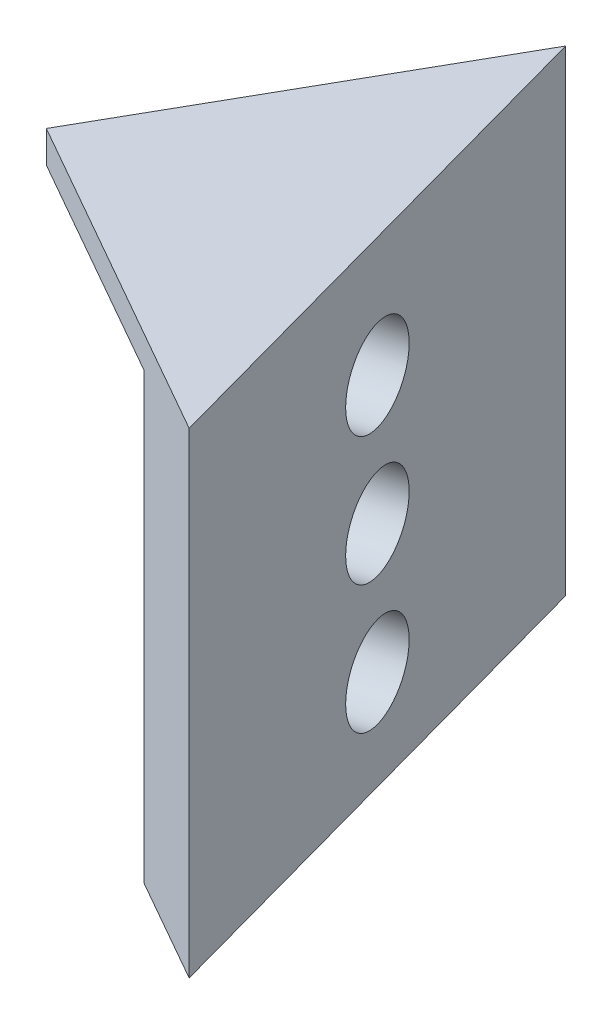
ISO-10303-21;
HEADER;
FILE_DESCRIPTION(('STEP AP214'),'2;1');
FILE_NAME('part.step','',(''),(''),'','','');
FILE_SCHEMA(('AUTOMOTIVE_DESIGN { 1 0 10303 214 1 1 1 1 }'));
ENDSEC;
DATA;
#1=APPLICATION_CONTEXT('core data for automotive mechanical design processes');
#2=APPLICATION_PROTOCOL_DEFINITION('international standard','automotive_design',2000,#1);
#3=PRODUCT_CONTEXT('',#1,'mechanical');
#4=PRODUCT('Part','Part','',(#3));
#5=PRODUCT_RELATED_PRODUCT_CATEGORY('part','',(#4));
#6=PRODUCT_DEFINITION_FORMATION('','',#4);
#7=PRODUCT_DEFINITION_CONTEXT('part definition',#1,'design');
#8=PRODUCT_DEFINITION('design','',#6,#7);
#9=PRODUCT_DEFINITION_SHAPE('','',#8);
#10=(LENGTH_UNIT() NAMED_UNIT(*) SI_UNIT(.MILLI.,.METRE.));
#11=(NAMED_UNIT(*) PLANE_ANGLE_UNIT() SI_UNIT($,.RADIAN.));
#12=(NAMED_UNIT(*) SI_UNIT($,.STERADIAN.) SOLID_ANGLE_UNIT());
#13=UNCERTAINTY_MEASURE_WITH_UNIT(LENGTH_MEASURE(1.E-05),#10,'distance_accuracy_value','');
#14=(GEOMETRIC_REPRESENTATION_CONTEXT(3) GLOBAL_UNCERTAINTY_ASSIGNED_CONTEXT((#13)) GLOBAL_UNIT_ASSIGNED_CONTEXT((#10,
#11,#12)) REPRESENTATION_CONTEXT('',''));
#15=CARTESIAN_POINT('',(0.,0.,0.));
#16=DIRECTION('',(0.,0.,1.));
#17=DIRECTION('',(1.,0.,0.));
#18=AXIS2_PLACEMENT_3D('',#15,#16,#17);
#19=CARTESIAN_POINT('',(0.,25.4,0.));
#20=DIRECTION('',(0.869294507164745,0.,0.494294507164709));
#21=DIRECTION('',(0.494294507164709,0.,-0.869294507164745));
#22=AXIS2_PLACEMENT_3D('',#19,#20,#21);
#23=PLANE('',#22);
#24=DIRECTION('',(0.,-1.,0.));
#25=VECTOR('',#24,1.);
#26=CARTESIAN_POINT('',(0.,25.4,0.));
#27=LINE('',#26,#25);
#28=CARTESIAN_POINT('',(0.,25.4,0.));
#29=VERTEX_POINT('',#28);
#30=CARTESIAN_POINT('',(0.,0.,0.));
#31=VERTEX_POINT('',#30);
#32=EDGE_CURVE('E53',#29,#31,#27,.T.);
#33=ORIENTED_EDGE('',*,*,#32,.F.);
#34=DIRECTION('',(-0.494294507164709,0.,0.869294507164745));
#35=VECTOR('',#34,1.);
#36=CARTESIAN_POINT('',(0.,25.4,0.));
#37=LINE('',#36,#35);
#38=CARTESIAN_POINT('',(150.660965783814,25.4,-264.960965783834));
#39=VERTEX_POINT('',#38);
#40=EDGE_CURVE('E100',#39,#29,#37,.T.);
#41=ORIENTED_EDGE('',*,*,#40,.F.);
#42=DIRECTION('',(0.,-1.,0.));
#43=VECTOR('',#42,1.);
#44=CARTESIAN_POINT('',(150.660965783814,25.4,-264.960965783834));
#45=LINE('',#44,#43);
#46=CARTESIAN_POINT('',(150.660965783814,-355.6,-264.960965783834));
#47=VERTEX_POINT('',#46);
#48=EDGE_CURVE('E97',#39,#47,#45,.T.);
#49=ORIENTED_EDGE('',*,*,#48,.T.);
#50=DIRECTION('',(-0.494294507164709,0.,0.869294507164745));
#51=VECTOR('',#50,1.);
#52=CARTESIAN_POINT('',(150.660965783814,-355.6,-264.960965783834));
#53=LINE('',#52,#51);
#54=CARTESIAN_POINT('',(102.937728623796,-355.6,-181.032159523601));
#55=VERTEX_POINT('',#54);
#56=EDGE_CURVE('E99',#47,#55,#53,.T.);
#57=ORIENTED_EDGE('',*,*,#56,.T.);
#58=DIRECTION('',(0.,1.,0.));
#59=VECTOR('',#58,1.);
#60=CARTESIAN_POINT('',(102.937728623796,-355.6,-181.032159523601));
#61=LINE('',#60,#59);
#62=CARTESIAN_POINT('',(102.937728623796,0.,-181.032159523601));
#63=VERTEX_POINT('',#62);
#64=EDGE_CURVE('E60',#55,#63,#61,.T.);
#65=ORIENTED_EDGE('',*,*,#64,.T.);
#66=DIRECTION('',(-0.494294507164709,0.,0.869294507164745));
#67=VECTOR('',#66,1.);
#68=CARTESIAN_POINT('',(0.,0.,0.));
#69=LINE('',#68,#67);
#70=EDGE_CURVE('E77',#63,#31,#69,.T.);
#71=ORIENTED_EDGE('',*,*,#70,.T.);
#72=EDGE_LOOP('',(#33,#41,#49,#57,#65,#71));
#73=FACE_BOUND('',#72,.T.);
#74=ADVANCED_FACE('F45',(#73),#23,.F.);
#75=CARTESIAN_POINT('',(0.,25.4,0.));
#76=DIRECTION('',(0.494294507164709,0.,-0.869294507164745));
#77=DIRECTION('',(-0.869294507164745,0.,-0.494294507164709));
#78=AXIS2_PLACEMENT_3D('',#75,#76,#77);
#79=PLANE('',#78);
#80=DIRECTION('',(0.869294507164745,0.,0.494294507164709));
#81=VECTOR('',#80,1.);
#82=CARTESIAN_POINT('',(0.,0.,0.));
#83=LINE('',#82,#81);
#84=CARTESIAN_POINT('',(181.032159523588,0.,102.937728623789));
#85=VERTEX_POINT('',#84);
#86=EDGE_CURVE('E139',#31,#85,#83,.T.);
#87=ORIENTED_EDGE('',*,*,#86,.T.);
#88=DIRECTION('',(0.,1.,0.));
#89=VECTOR('',#88,1.);
#90=CARTESIAN_POINT('',(181.032159523588,-355.6,102.937728623789));
#91=LINE('',#90,#89);
#92=CARTESIAN_POINT('',(181.032159523588,-355.6,102.937728623789));
#93=VERTEX_POINT('',#92);
#94=EDGE_CURVE('E85',#93,#85,#91,.T.);
#95=ORIENTED_EDGE('',*,*,#94,.F.);
#96=DIRECTION('',(0.869294507164745,0.,0.494294507164709));
#97=VECTOR('',#96,1.);
#98=CARTESIAN_POINT('',(264.960965783814,-355.6,150.660965783803));
#99=LINE('',#98,#97);
#100=CARTESIAN_POINT('',(264.960965783814,-355.6,150.660965783803));
#101=VERTEX_POINT('',#100);
#102=EDGE_CURVE('E129',#93,#101,#99,.T.);
#103=ORIENTED_EDGE('',*,*,#102,.T.);
#104=DIRECTION('',(0.,-1.,0.));
#105=VECTOR('',#104,1.);
#106=CARTESIAN_POINT('',(264.960965783814,25.4,150.660965783803));
#107=LINE('',#106,#105);
#108=CARTESIAN_POINT('',(264.960965783814,25.4,150.660965783803));
#109=VERTEX_POINT('',#108);
#110=EDGE_CURVE('E104',#109,#101,#107,.T.);
#111=ORIENTED_EDGE('',*,*,#110,.F.);
#112=DIRECTION('',(0.869294507164745,0.,0.494294507164709));
#113=VECTOR('',#112,1.);
#114=CARTESIAN_POINT('',(0.,25.4,0.));
#115=LINE('',#114,#113);
#116=EDGE_CURVE('E138',#29,#109,#115,.T.);
#117=ORIENTED_EDGE('',*,*,#116,.F.);
#118=ORIENTED_EDGE('',*,*,#32,.T.);
#119=EDGE_LOOP('',(#87,#95,#103,#111,#117,#118));
#120=FACE_BOUND('',#119,.T.);
#121=ADVANCED_FACE('F154',(#120),#79,.F.);
#122=CARTESIAN_POINT('',(264.960965783814,25.4,150.660965783803));
#123=DIRECTION('',(-0.964203038783847,0.,0.265165042944946));
#124=DIRECTION('',(0.265165042944946,0.,0.964203038783847));
#125=AXIS2_PLACEMENT_3D('',#122,#123,#124);
#126=PLANE('',#125);
#127=CARTESIAN_POINT('',(207.810965783816,-70.2908417812,-57.1500000000104));
#128=DIRECTION('',(-0.964203038783847,0.,0.265165042944946));
#129=DIRECTION('',(0.265165042944946,0.,0.964203038783847));
#130=AXIS2_PLACEMENT_3D('',#127,#128,#129);
#131=CIRCLE('',#130,36.3534813930903);
#132=CARTESIAN_POINT('',(217.450638238613,-70.2908417812,-22.0978627704207));
#133=VERTEX_POINT('',#132);
#134=EDGE_CURVE('E119',#133,#133,#131,.T.);
#135=ORIENTED_EDGE('',*,*,#134,.T.);
#136=EDGE_LOOP('',(#135));
#137=FACE_BOUND('',#136,.T.);
#138=CARTESIAN_POINT('',(207.810965783819,-173.124599598457,-57.15));
#139=DIRECTION('',(-0.964203038783847,0.,0.265165042944946));
#140=DIRECTION('',(0.265165042944946,0.,0.964203038783847));
#141=AXIS2_PLACEMENT_3D('',#138,#139,#140);
#142=CIRCLE('',#141,36.35348139308);
#143=CARTESIAN_POINT('',(217.450638238613,-173.124599598457,-22.0978627704202));
#144=VERTEX_POINT('',#143);
#145=EDGE_CURVE('E123',#144,#144,#142,.T.);
#146=ORIENTED_EDGE('',*,*,#145,.T.);
#147=EDGE_LOOP('',(#146));
#148=FACE_BOUND('',#147,.T.);
#149=CARTESIAN_POINT('',(207.810965783816,-275.958357415713,-57.1500000000103));
#150=DIRECTION('',(-0.964203038783847,0.,0.265165042944946));
#151=DIRECTION('',(0.265165042944946,0.,0.964203038783847));
#152=AXIS2_PLACEMENT_3D('',#149,#150,#151);
#153=CIRCLE('',#152,36.3534813930903);
#154=CARTESIAN_POINT('',(217.450638238613,-275.958357415713,-22.0978627704206));
#155=VERTEX_POINT('',#154);
#156=EDGE_CURVE('E251',#155,#155,#153,.T.);
#157=ORIENTED_EDGE('',*,*,#156,.T.);
#158=EDGE_LOOP('',(#157));
#159=FACE_BOUND('',#158,.T.);
#160=ORIENTED_EDGE('',*,*,#110,.T.);
#161=DIRECTION('',(-0.265165042944946,0.,-0.964203038783847));
#162=VECTOR('',#161,1.);
#163=CARTESIAN_POINT('',(150.660965783814,-355.6,-264.960965783834));
#164=LINE('',#163,#162);
#165=EDGE_CURVE('E111',#101,#47,#164,.T.);
#166=ORIENTED_EDGE('',*,*,#165,.T.);
#167=ORIENTED_EDGE('',*,*,#48,.F.);
#168=DIRECTION('',(-0.265165042944946,0.,-0.964203038783847));
#169=VECTOR('',#168,1.);
#170=CARTESIAN_POINT('',(264.960965783814,25.4,150.660965783803));
#171=LINE('',#170,#169);
#172=EDGE_CURVE('E68',#109,#39,#171,.T.);
#173=ORIENTED_EDGE('',*,*,#172,.F.);
#174=EDGE_LOOP('',(#160,#166,#167,#173));
#175=FACE_BOUND('',#174,.T.);
#176=ADVANCED_FACE('F116',(#137,#148,#159,#175),#126,.F.);
#177=CARTESIAN_POINT('',(0.,25.4,0.));
#178=DIRECTION('',(0.,-1.,0.));
#179=DIRECTION('',(0.,0.,-1.));
#180=AXIS2_PLACEMENT_3D('',#177,#178,#179);
#181=PLANE('',#180);
#182=ORIENTED_EDGE('',*,*,#116,.T.);
#183=ORIENTED_EDGE('',*,*,#172,.T.);
#184=ORIENTED_EDGE('',*,*,#40,.T.);
#185=EDGE_LOOP('',(#182,#183,#184));
#186=FACE_BOUND('',#185,.T.);
#187=ADVANCED_FACE('F155',(#186),#181,.F.);
#188=CARTESIAN_POINT('',(0.,0.,0.));
#189=DIRECTION('',(0.,-1.,0.));
#190=DIRECTION('',(0.,0.,-1.));
#191=AXIS2_PLACEMENT_3D('',#188,#189,#190);
#192=PLANE('',#191);
#193=DIRECTION('',(-0.265165042944946,0.,-0.964203038783847));
#194=VECTOR('',#193,1.);
#195=CARTESIAN_POINT('',(141.984944073695,0.,-39.0472154498957));
#196=LINE('',#195,#194);
#197=EDGE_CURVE('E11',#85,#63,#196,.T.);
#198=ORIENTED_EDGE('',*,*,#197,.F.);
#199=ORIENTED_EDGE('',*,*,#86,.F.);
#200=ORIENTED_EDGE('',*,*,#70,.F.);
#201=EDGE_LOOP('',(#198,#199,#200));
#202=FACE_BOUND('',#201,.T.);
#203=ADVANCED_FACE('F157',(#202),#192,.T.);
#204=CARTESIAN_POINT('',(181.032159523588,-355.6,102.937728623789));
#205=DIRECTION('',(-0.964203038783847,0.,0.265165042944946));
#206=DIRECTION('',(0.265165042944946,0.,0.964203038783847));
#207=AXIS2_PLACEMENT_3D('',#204,#205,#206);
#208=PLANE('',#207);
#209=CARTESIAN_POINT('',(141.984944073692,-70.2908417812,-39.0472154499061));
#210=DIRECTION('',(-0.964203038783847,0.,0.265165042944946));
#211=DIRECTION('',(0.265165042944946,0.,0.964203038783847));
#212=AXIS2_PLACEMENT_3D('',#209,#210,#211);
#213=CIRCLE('',#212,36.3534813930903);
#214=CARTESIAN_POINT('',(151.624616528489,-70.2908417812,-3.99507822031638));
#215=VERTEX_POINT('',#214);
#216=EDGE_CURVE('E243',#215,#215,#213,.T.);
#217=ORIENTED_EDGE('',*,*,#216,.F.);
#218=EDGE_LOOP('',(#217));
#219=FACE_BOUND('',#218,.T.);
#220=CARTESIAN_POINT('',(141.984944073695,-173.124599598457,-39.0472154498957));
#221=DIRECTION('',(-0.964203038783847,0.,0.265165042944946));
#222=DIRECTION('',(0.265165042944946,0.,0.964203038783847));
#223=AXIS2_PLACEMENT_3D('',#220,#221,#222);
#224=CIRCLE('',#223,36.35348139308);
#225=CARTESIAN_POINT('',(151.624616528489,-173.124599598457,-3.9950782203159));
#226=VERTEX_POINT('',#225);
#227=EDGE_CURVE('E257',#226,#226,#224,.T.);
#228=ORIENTED_EDGE('',*,*,#227,.F.);
#229=EDGE_LOOP('',(#228));
#230=FACE_BOUND('',#229,.T.);
#231=CARTESIAN_POINT('',(141.984944073692,-275.958357415713,-39.047215449906));
#232=DIRECTION('',(-0.964203038783847,0.,0.265165042944946));
#233=DIRECTION('',(0.265165042944946,0.,0.964203038783847));
#234=AXIS2_PLACEMENT_3D('',#231,#232,#233);
#235=CIRCLE('',#234,36.3534813930903);
#236=CARTESIAN_POINT('',(151.624616528489,-275.958357415713,-3.99507822031629));
#237=VERTEX_POINT('',#236);
#238=EDGE_CURVE('E260',#237,#237,#235,.T.);
#239=ORIENTED_EDGE('',*,*,#238,.F.);
#240=EDGE_LOOP('',(#239));
#241=FACE_BOUND('',#240,.T.);
#242=ORIENTED_EDGE('',*,*,#94,.T.);
#243=ORIENTED_EDGE('',*,*,#197,.T.);
#244=ORIENTED_EDGE('',*,*,#64,.F.);
#245=DIRECTION('',(0.265165042944946,0.,0.964203038783847));
#246=VECTOR('',#245,1.);
#247=CARTESIAN_POINT('',(181.032159523588,-355.6,102.937728623789));
#248=LINE('',#247,#246);
#249=EDGE_CURVE('E113',#55,#93,#248,.T.);
#250=ORIENTED_EDGE('',*,*,#249,.T.);
#251=EDGE_LOOP('',(#242,#243,#244,#250));
#252=FACE_BOUND('',#251,.T.);
#253=ADVANCED_FACE('F163',(#219,#230,#241,#252),#208,.T.);
#254=CARTESIAN_POINT('',(0.,-355.6,0.));
#255=DIRECTION('',(0.,-1.,0.));
#256=DIRECTION('',(0.,0.,-1.));
#257=AXIS2_PLACEMENT_3D('',#254,#255,#256);
#258=PLANE('',#257);
#259=ORIENTED_EDGE('',*,*,#165,.F.);
#260=ORIENTED_EDGE('',*,*,#102,.F.);
#261=ORIENTED_EDGE('',*,*,#249,.F.);
#262=ORIENTED_EDGE('',*,*,#56,.F.);
#263=EDGE_LOOP('',(#259,#260,#261,#262));
#264=FACE_BOUND('',#263,.T.);
#265=ADVANCED_FACE('F109',(#264),#258,.T.);
#266=CARTESIAN_POINT('',(509.346301850338,-275.958357415713,-140.07509681193));
#267=DIRECTION('',(-0.964203038783847,0.,0.265165042944946));
#268=DIRECTION('',(0.265165042944946,0.,0.964203038783847));
#269=AXIS2_PLACEMENT_3D('',#266,#267,#268);
#270=CYLINDRICAL_SURFACE('',#269,36.3534813930903);
#271=ORIENTED_EDGE('',*,*,#238,.T.);
#272=EDGE_LOOP('',(#271));
#273=FACE_BOUND('',#272,.T.);
#274=ORIENTED_EDGE('',*,*,#156,.F.);
#275=EDGE_LOOP('',(#274));
#276=FACE_BOUND('',#275,.T.);
#277=ADVANCED_FACE('F209',(#273,#276),#270,.F.);
#278=CARTESIAN_POINT('',(509.346301850341,-173.124599598457,-140.07509681192));
#279=DIRECTION('',(-0.964203038783847,0.,0.265165042944946));
#280=DIRECTION('',(0.265165042944946,0.,0.964203038783847));
#281=AXIS2_PLACEMENT_3D('',#278,#279,#280);
#282=CYLINDRICAL_SURFACE('',#281,36.35348139308);
#283=ORIENTED_EDGE('',*,*,#227,.T.);
#284=EDGE_LOOP('',(#283));
#285=FACE_BOUND('',#284,.T.);
#286=ORIENTED_EDGE('',*,*,#145,.F.);
#287=EDGE_LOOP('',(#286));
#288=FACE_BOUND('',#287,.T.);
#289=ADVANCED_FACE('F217',(#285,#288),#282,.F.);
#290=CARTESIAN_POINT('',(509.346301850338,-70.2908417812,-140.07509681193));
#291=DIRECTION('',(-0.964203038783847,0.,0.265165042944946));
#292=DIRECTION('',(0.265165042944946,0.,0.964203038783847));
#293=AXIS2_PLACEMENT_3D('',#290,#291,#292);
#294=CYLINDRICAL_SURFACE('',#293,36.3534813930903);
#295=ORIENTED_EDGE('',*,*,#216,.T.);
#296=EDGE_LOOP('',(#295));
#297=FACE_BOUND('',#296,.T.);
#298=ORIENTED_EDGE('',*,*,#134,.F.);
#299=EDGE_LOOP('',(#298));
#300=FACE_BOUND('',#299,.T.);
#301=ADVANCED_FACE('F227',(#297,#300),#294,.F.);
#302=CLOSED_SHELL('',(#74,#121,#176,#187,#203,#253,#265,#277,#289,#301));
#303=MANIFOLD_SOLID_BREP('B2',#302);
#304=ADVANCED_BREP_SHAPE_REPRESENTATION('',(#18,#303),#14);
#305=SHAPE_DEFINITION_REPRESENTATION(#9,#304);
ENDSEC;
END-ISO-10303-21;
